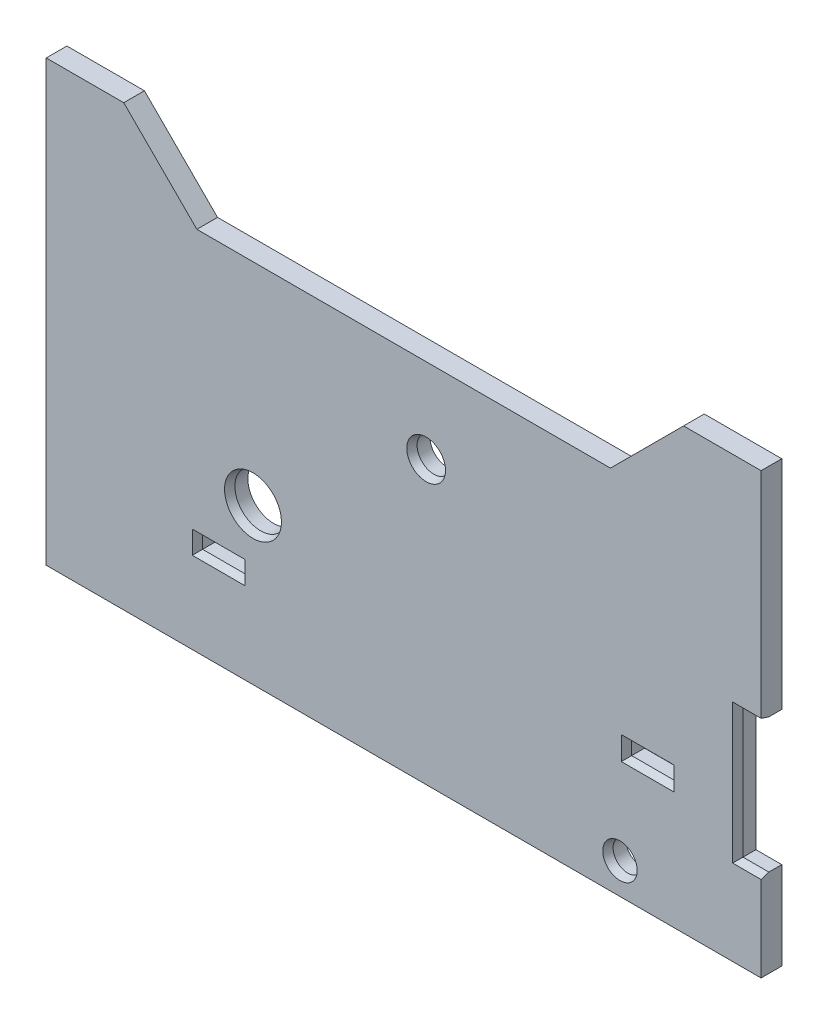
ISO-10303-21;
HEADER;
FILE_DESCRIPTION(('STEP AP214'),'2;1');
FILE_NAME('part.step','',(''),(''),'','','');
FILE_SCHEMA(('AUTOMOTIVE_DESIGN { 1 0 10303 214 1 1 1 1 }'));
ENDSEC;
DATA;
#1=APPLICATION_CONTEXT('core data for automotive mechanical design processes');
#2=APPLICATION_PROTOCOL_DEFINITION('international standard','automotive_design',2000,#1);
#3=PRODUCT_CONTEXT('',#1,'mechanical');
#4=PRODUCT('Part','Part','',(#3));
#5=PRODUCT_RELATED_PRODUCT_CATEGORY('part','',(#4));
#6=PRODUCT_DEFINITION_FORMATION('','',#4);
#7=PRODUCT_DEFINITION_CONTEXT('part definition',#1,'design');
#8=PRODUCT_DEFINITION('design','',#6,#7);
#9=PRODUCT_DEFINITION_SHAPE('','',#8);
#10=(LENGTH_UNIT() NAMED_UNIT(*) SI_UNIT(.MILLI.,.METRE.));
#11=(NAMED_UNIT(*) PLANE_ANGLE_UNIT() SI_UNIT($,.RADIAN.));
#12=(NAMED_UNIT(*) SI_UNIT($,.STERADIAN.) SOLID_ANGLE_UNIT());
#13=UNCERTAINTY_MEASURE_WITH_UNIT(LENGTH_MEASURE(1.E-05),#10,'distance_accuracy_value','');
#14=(GEOMETRIC_REPRESENTATION_CONTEXT(3) GLOBAL_UNCERTAINTY_ASSIGNED_CONTEXT((#13)) GLOBAL_UNIT_ASSIGNED_CONTEXT((#10,
#11,#12)) REPRESENTATION_CONTEXT('',''));
#15=CARTESIAN_POINT('',(0.,0.,0.));
#16=DIRECTION('',(0.,0.,1.));
#17=DIRECTION('',(1.,0.,0.));
#18=AXIS2_PLACEMENT_3D('',#15,#16,#17);
#19=CARTESIAN_POINT('',(0.,0.,2.));
#20=DIRECTION('',(0.,0.,-1.));
#21=DIRECTION('',(-1.,0.,0.));
#22=AXIS2_PLACEMENT_3D('',#19,#20,#21);
#23=PLANE('',#22);
#24=CARTESIAN_POINT('',(25.,-24.,2.));
#25=DIRECTION('',(0.,0.,-1.));
#26=DIRECTION('',(-1.,0.,0.));
#27=AXIS2_PLACEMENT_3D('',#24,#25,#26);
#28=CIRCLE('',#27,3.33000000000003);
#29=CARTESIAN_POINT('',(21.67,-24.,2.));
#30=VERTEX_POINT('',#29);
#31=EDGE_CURVE('E379',#30,#30,#28,.T.);
#32=ORIENTED_EDGE('',*,*,#31,.T.);
#33=EDGE_LOOP('',(#32));
#34=FACE_BOUND('',#33,.T.);
#35=DIRECTION('',(0.,-1.,0.));
#36=VECTOR('',#35,1.);
#37=CARTESIAN_POINT('',(35.45,-6.765,2.));
#38=LINE('',#37,#36);
#39=CARTESIAN_POINT('',(35.45,-2.735,2.));
#40=VERTEX_POINT('',#39);
#41=CARTESIAN_POINT('',(35.45,-7.265,2.));
#42=VERTEX_POINT('',#41);
#43=EDGE_CURVE('E370',#40,#42,#38,.T.);
#44=ORIENTED_EDGE('',*,*,#43,.T.);
#45=DIRECTION('',(-1.,0.,0.));
#46=VECTOR('',#45,1.);
#47=CARTESIAN_POINT('',(25.75,-7.265,2.));
#48=LINE('',#47,#46);
#49=CARTESIAN_POINT('',(25.25,-7.265,2.));
#50=VERTEX_POINT('',#49);
#51=EDGE_CURVE('E376',#42,#50,#48,.T.);
#52=ORIENTED_EDGE('',*,*,#51,.T.);
#53=DIRECTION('',(0.,1.,0.));
#54=VECTOR('',#53,1.);
#55=CARTESIAN_POINT('',(25.25,-3.235,2.));
#56=LINE('',#55,#54);
#57=CARTESIAN_POINT('',(25.25,-2.735,2.));
#58=VERTEX_POINT('',#57);
#59=EDGE_CURVE('E374',#50,#58,#56,.T.);
#60=ORIENTED_EDGE('',*,*,#59,.T.);
#61=DIRECTION('',(1.,0.,0.));
#62=VECTOR('',#61,1.);
#63=CARTESIAN_POINT('',(34.95,-2.735,2.));
#64=LINE('',#63,#62);
#65=EDGE_CURVE('E372',#58,#40,#64,.T.);
#66=ORIENTED_EDGE('',*,*,#65,.T.);
#67=EDGE_LOOP('',(#44,#52,#60,#66));
#68=FACE_BOUND('',#67,.T.);
#69=DIRECTION('',(1.,0.,0.));
#70=VECTOR('',#69,1.);
#71=CARTESIAN_POINT('',(-48.05,-9.80000000000001,2.));
#72=LINE('',#71,#70);
#73=CARTESIAN_POINT('',(-57.75,-9.80000000000001,2.));
#74=VERTEX_POINT('',#73);
#75=CARTESIAN_POINT('',(-47.55,-9.80000000000001,2.));
#76=VERTEX_POINT('',#75);
#77=EDGE_CURVE('E361',#74,#76,#72,.T.);
#78=ORIENTED_EDGE('',*,*,#77,.T.);
#79=DIRECTION('',(0.,-1.,0.));
#80=VECTOR('',#79,1.);
#81=CARTESIAN_POINT('',(-47.55,-13.7,2.));
#82=LINE('',#81,#80);
#83=CARTESIAN_POINT('',(-47.55,-14.2,2.));
#84=VERTEX_POINT('',#83);
#85=EDGE_CURVE('E367',#76,#84,#82,.T.);
#86=ORIENTED_EDGE('',*,*,#85,.T.);
#87=DIRECTION('',(-1.,0.,0.));
#88=VECTOR('',#87,1.);
#89=CARTESIAN_POINT('',(-57.25,-14.2,2.));
#90=LINE('',#89,#88);
#91=CARTESIAN_POINT('',(-57.75,-14.2,2.));
#92=VERTEX_POINT('',#91);
#93=EDGE_CURVE('E365',#84,#92,#90,.T.);
#94=ORIENTED_EDGE('',*,*,#93,.T.);
#95=DIRECTION('',(0.,1.,0.));
#96=VECTOR('',#95,1.);
#97=CARTESIAN_POINT('',(-57.75,-10.3,2.));
#98=LINE('',#97,#96);
#99=EDGE_CURVE('E363',#92,#74,#98,.T.);
#100=ORIENTED_EDGE('',*,*,#99,.T.);
#101=EDGE_LOOP('',(#78,#86,#94,#100));
#102=FACE_BOUND('',#101,.T.);
#103=CARTESIAN_POINT('',(-46.,0.,2.));
#104=DIRECTION('',(0.,0.,-1.));
#105=DIRECTION('',(-1.,0.,0.));
#106=AXIS2_PLACEMENT_3D('',#103,#104,#105);
#107=CIRCLE('',#106,5.49999999999997);
#108=CARTESIAN_POINT('',(-51.5,0.,2.));
#109=VERTEX_POINT('',#108);
#110=EDGE_CURVE('E358',#109,#109,#107,.T.);
#111=ORIENTED_EDGE('',*,*,#110,.T.);
#112=EDGE_LOOP('',(#111));
#113=FACE_BOUND('',#112,.T.);
#114=CARTESIAN_POINT('',(-12.5,24.5,2.));
#115=DIRECTION('',(0.,0.,-1.));
#116=DIRECTION('',(-1.,0.,0.));
#117=AXIS2_PLACEMENT_3D('',#114,#115,#116);
#118=CIRCLE('',#117,3.75000000000003);
#119=CARTESIAN_POINT('',(-16.25,24.5,2.));
#120=VERTEX_POINT('',#119);
#121=EDGE_CURVE('E355',#120,#120,#118,.T.);
#122=ORIENTED_EDGE('',*,*,#121,.T.);
#123=EDGE_LOOP('',(#122));
#124=FACE_BOUND('',#123,.T.);
#125=DIRECTION('',(0.,1.,0.));
#126=VECTOR('',#125,1.);
#127=CARTESIAN_POINT('',(52.3,-13.,2.));
#128=LINE('',#127,#126);
#129=CARTESIAN_POINT('',(52.3,-30.,2.));
#130=VERTEX_POINT('',#129);
#131=CARTESIAN_POINT('',(52.3,-13.5,2.));
#132=VERTEX_POINT('',#131);
#133=EDGE_CURVE('E216',#130,#132,#128,.T.);
#134=ORIENTED_EDGE('',*,*,#133,.T.);
#135=DIRECTION('',(-1.,0.,0.));
#136=VECTOR('',#135,1.);
#137=CARTESIAN_POINT('',(0.,-13.5,2.));
#138=LINE('',#137,#136);
#139=CARTESIAN_POINT('',(46.8000000000001,-13.5,2.));
#140=VERTEX_POINT('',#139);
#141=EDGE_CURVE('E428',#132,#140,#138,.T.);
#142=ORIENTED_EDGE('',*,*,#141,.T.);
#143=DIRECTION('',(0.,1.,0.));
#144=VECTOR('',#143,1.);
#145=CARTESIAN_POINT('',(46.8,1.49880108324396E-13,2.));
#146=LINE('',#145,#144);
#147=CARTESIAN_POINT('',(46.8,13.5,2.));
#148=VERTEX_POINT('',#147);
#149=EDGE_CURVE('E426',#140,#148,#146,.T.);
#150=ORIENTED_EDGE('',*,*,#149,.T.);
#151=DIRECTION('',(1.,0.,0.));
#152=VECTOR('',#151,1.);
#153=CARTESIAN_POINT('',(0.,13.5,2.));
#154=LINE('',#153,#152);
#155=CARTESIAN_POINT('',(52.3,13.5,2.));
#156=VERTEX_POINT('',#155);
#157=EDGE_CURVE('E214',#148,#156,#154,.T.);
#158=ORIENTED_EDGE('',*,*,#157,.T.);
#159=DIRECTION('',(0.,1.,0.));
#160=VECTOR('',#159,1.);
#161=CARTESIAN_POINT('',(52.3,30.,2.));
#162=LINE('',#161,#160);
#163=CARTESIAN_POINT('',(52.3,55.,2.));
#164=VERTEX_POINT('',#163);
#165=EDGE_CURVE('E207',#156,#164,#162,.T.);
#166=ORIENTED_EDGE('',*,*,#165,.T.);
#167=DIRECTION('',(-1.,0.,0.));
#168=VECTOR('',#167,1.);
#169=CARTESIAN_POINT('',(52.3,55.,2.));
#170=LINE('',#169,#168);
#171=CARTESIAN_POINT('',(37.3,55.,2.));
#172=VERTEX_POINT('',#171);
#173=EDGE_CURVE('E211',#164,#172,#170,.T.);
#174=ORIENTED_EDGE('',*,*,#173,.T.);
#175=DIRECTION('',(-0.707106781186548,-0.707106781186546,0.));
#176=VECTOR('',#175,1.);
#177=CARTESIAN_POINT('',(37.3,55.,2.));
#178=LINE('',#177,#176);
#179=CARTESIAN_POINT('',(23.157864376269,40.857864376269,2.));
#180=VERTEX_POINT('',#179);
#181=EDGE_CURVE('E231',#172,#180,#178,.T.);
#182=ORIENTED_EDGE('',*,*,#181,.T.);
#183=DIRECTION('',(-1.,0.,0.));
#184=VECTOR('',#183,1.);
#185=CARTESIAN_POINT('',(23.157864376269,40.857864376269,2.));
#186=LINE('',#185,#184);
#187=CARTESIAN_POINT('',(-56.8578643762691,40.857864376269,2.));
#188=VERTEX_POINT('',#187);
#189=EDGE_CURVE('E234',#180,#188,#186,.T.);
#190=ORIENTED_EDGE('',*,*,#189,.T.);
#191=DIRECTION('',(-0.707106781186547,0.707106781186548,0.));
#192=VECTOR('',#191,1.);
#193=CARTESIAN_POINT('',(-56.8578643762691,40.857864376269,2.));
#194=LINE('',#193,#192);
#195=CARTESIAN_POINT('',(-71.,55.,2.));
#196=VERTEX_POINT('',#195);
#197=EDGE_CURVE('E241',#188,#196,#194,.T.);
#198=ORIENTED_EDGE('',*,*,#197,.T.);
#199=DIRECTION('',(-1.,0.,0.));
#200=VECTOR('',#199,1.);
#201=CARTESIAN_POINT('',(-71.,55.,2.));
#202=LINE('',#201,#200);
#203=CARTESIAN_POINT('',(-86.,55.,2.));
#204=VERTEX_POINT('',#203);
#205=EDGE_CURVE('E243',#196,#204,#202,.T.);
#206=ORIENTED_EDGE('',*,*,#205,.T.);
#207=DIRECTION('',(0.,-1.,0.));
#208=VECTOR('',#207,1.);
#209=CARTESIAN_POINT('',(-86.,-30.,2.));
#210=LINE('',#209,#208);
#211=CARTESIAN_POINT('',(-86.,-30.,2.));
#212=VERTEX_POINT('',#211);
#213=EDGE_CURVE('E215',#204,#212,#210,.T.);
#214=ORIENTED_EDGE('',*,*,#213,.T.);
#215=DIRECTION('',(1.,0.,0.));
#216=VECTOR('',#215,1.);
#217=CARTESIAN_POINT('',(-86.,-30.,2.));
#218=LINE('',#217,#216);
#219=EDGE_CURVE('E316',#212,#130,#218,.T.);
#220=ORIENTED_EDGE('',*,*,#219,.T.);
#221=EDGE_LOOP('',(#134,#142,#150,#158,#166,#174,#182,#190,#198,#206,#214,#220));
#222=FACE_BOUND('',#221,.T.);
#223=ADVANCED_FACE('F35',(#34,#68,#102,#113,#124,#222),#23,.F.);
#224=CARTESIAN_POINT('',(0.,0.,-2.));
#225=DIRECTION('',(0.,0.,-1.));
#226=DIRECTION('',(-1.,0.,0.));
#227=AXIS2_PLACEMENT_3D('',#224,#225,#226);
#228=PLANE('',#227);
#229=DIRECTION('',(-1.,0.,0.));
#230=VECTOR('',#229,1.);
#231=CARTESIAN_POINT('',(25.75,-3.235,-2.));
#232=LINE('',#231,#230);
#233=CARTESIAN_POINT('',(34.95,-3.235,-2.));
#234=VERTEX_POINT('',#233);
#235=CARTESIAN_POINT('',(25.75,-3.235,-2.));
#236=VERTEX_POINT('',#235);
#237=EDGE_CURVE('E278',#234,#236,#232,.T.);
#238=ORIENTED_EDGE('',*,*,#237,.T.);
#239=DIRECTION('',(0.,-1.,0.));
#240=VECTOR('',#239,1.);
#241=CARTESIAN_POINT('',(25.75,-3.235,-2.));
#242=LINE('',#241,#240);
#243=CARTESIAN_POINT('',(25.75,-6.765,-2.));
#244=VERTEX_POINT('',#243);
#245=EDGE_CURVE('E269',#236,#244,#242,.T.);
#246=ORIENTED_EDGE('',*,*,#245,.T.);
#247=DIRECTION('',(1.,0.,0.));
#248=VECTOR('',#247,1.);
#249=CARTESIAN_POINT('',(25.75,-6.765,-2.));
#250=LINE('',#249,#248);
#251=CARTESIAN_POINT('',(34.95,-6.765,-2.));
#252=VERTEX_POINT('',#251);
#253=EDGE_CURVE('E272',#244,#252,#250,.T.);
#254=ORIENTED_EDGE('',*,*,#253,.T.);
#255=DIRECTION('',(0.,1.,0.));
#256=VECTOR('',#255,1.);
#257=CARTESIAN_POINT('',(34.95,-3.235,-2.));
#258=LINE('',#257,#256);
#259=EDGE_CURVE('E275',#252,#234,#258,.T.);
#260=ORIENTED_EDGE('',*,*,#259,.T.);
#261=EDGE_LOOP('',(#238,#246,#254,#260));
#262=FACE_BOUND('',#261,.T.);
#263=CARTESIAN_POINT('',(-46.,0.,-2.));
#264=DIRECTION('',(0.,0.,1.));
#265=DIRECTION('',(1.,0.,0.));
#266=AXIS2_PLACEMENT_3D('',#263,#264,#265);
#267=CIRCLE('',#266,5.);
#268=CARTESIAN_POINT('',(-41.,0.,-2.));
#269=VERTEX_POINT('',#268);
#270=EDGE_CURVE('E289',#269,#269,#267,.T.);
#271=ORIENTED_EDGE('',*,*,#270,.T.);
#272=EDGE_LOOP('',(#271));
#273=FACE_BOUND('',#272,.T.);
#274=DIRECTION('',(-1.,0.,0.));
#275=VECTOR('',#274,1.);
#276=CARTESIAN_POINT('',(-57.25,-10.3,-2.));
#277=LINE('',#276,#275);
#278=CARTESIAN_POINT('',(-48.05,-10.3,-2.));
#279=VERTEX_POINT('',#278);
#280=CARTESIAN_POINT('',(-57.25,-10.3,-2.));
#281=VERTEX_POINT('',#280);
#282=EDGE_CURVE('E304',#279,#281,#277,.T.);
#283=ORIENTED_EDGE('',*,*,#282,.T.);
#284=DIRECTION('',(0.,-1.,0.));
#285=VECTOR('',#284,1.);
#286=CARTESIAN_POINT('',(-57.25,-10.3,-2.));
#287=LINE('',#286,#285);
#288=CARTESIAN_POINT('',(-57.25,-13.7,-2.));
#289=VERTEX_POINT('',#288);
#290=EDGE_CURVE('E295',#281,#289,#287,.T.);
#291=ORIENTED_EDGE('',*,*,#290,.T.);
#292=DIRECTION('',(1.,0.,0.));
#293=VECTOR('',#292,1.);
#294=CARTESIAN_POINT('',(-57.25,-13.7,-2.));
#295=LINE('',#294,#293);
#296=CARTESIAN_POINT('',(-48.05,-13.7,-2.));
#297=VERTEX_POINT('',#296);
#298=EDGE_CURVE('E298',#289,#297,#295,.T.);
#299=ORIENTED_EDGE('',*,*,#298,.T.);
#300=DIRECTION('',(0.,1.,0.));
#301=VECTOR('',#300,1.);
#302=CARTESIAN_POINT('',(-48.05,-10.3,-2.));
#303=LINE('',#302,#301);
#304=EDGE_CURVE('E301',#297,#279,#303,.T.);
#305=ORIENTED_EDGE('',*,*,#304,.T.);
#306=EDGE_LOOP('',(#283,#291,#299,#305));
#307=FACE_BOUND('',#306,.T.);
#308=DIRECTION('',(1.,0.,0.));
#309=VECTOR('',#308,1.);
#310=CARTESIAN_POINT('',(-86.,-30.,-2.));
#311=LINE('',#310,#309);
#312=CARTESIAN_POINT('',(-86.,-30.,-2.));
#313=VERTEX_POINT('',#312);
#314=CARTESIAN_POINT('',(52.3,-30.,-2.));
#315=VERTEX_POINT('',#314);
#316=EDGE_CURVE('E315',#313,#315,#311,.T.);
#317=ORIENTED_EDGE('',*,*,#316,.F.);
#318=DIRECTION('',(0.,-1.,0.));
#319=VECTOR('',#318,1.);
#320=CARTESIAN_POINT('',(-86.,-30.,-2.));
#321=LINE('',#320,#319);
#322=CARTESIAN_POINT('',(-86.,55.,-2.));
#323=VERTEX_POINT('',#322);
#324=EDGE_CURVE('E319',#323,#313,#321,.T.);
#325=ORIENTED_EDGE('',*,*,#324,.F.);
#326=DIRECTION('',(-1.,0.,0.));
#327=VECTOR('',#326,1.);
#328=CARTESIAN_POINT('',(-71.,55.,-2.));
#329=LINE('',#328,#327);
#330=CARTESIAN_POINT('',(-71.,55.,-2.));
#331=VERTEX_POINT('',#330);
#332=EDGE_CURVE('E232',#331,#323,#329,.T.);
#333=ORIENTED_EDGE('',*,*,#332,.F.);
#334=DIRECTION('',(-0.707106781186547,0.707106781186548,0.));
#335=VECTOR('',#334,1.);
#336=CARTESIAN_POINT('',(-56.8578643762691,40.857864376269,-2.));
#337=LINE('',#336,#335);
#338=CARTESIAN_POINT('',(-56.8578643762691,40.857864376269,-2.));
#339=VERTEX_POINT('',#338);
#340=EDGE_CURVE('E237',#339,#331,#337,.T.);
#341=ORIENTED_EDGE('',*,*,#340,.F.);
#342=DIRECTION('',(-1.,0.,0.));
#343=VECTOR('',#342,1.);
#344=CARTESIAN_POINT('',(23.157864376269,40.857864376269,-2.));
#345=LINE('',#344,#343);
#346=CARTESIAN_POINT('',(23.157864376269,40.857864376269,-2.));
#347=VERTEX_POINT('',#346);
#348=EDGE_CURVE('E252',#347,#339,#345,.T.);
#349=ORIENTED_EDGE('',*,*,#348,.F.);
#350=DIRECTION('',(-0.707106781186548,-0.707106781186546,0.));
#351=VECTOR('',#350,1.);
#352=CARTESIAN_POINT('',(37.3,55.,-2.));
#353=LINE('',#352,#351);
#354=CARTESIAN_POINT('',(37.3,55.,-2.));
#355=VERTEX_POINT('',#354);
#356=EDGE_CURVE('E249',#355,#347,#353,.T.);
#357=ORIENTED_EDGE('',*,*,#356,.F.);
#358=DIRECTION('',(-1.,0.,0.));
#359=VECTOR('',#358,1.);
#360=CARTESIAN_POINT('',(52.3,55.,-2.));
#361=LINE('',#360,#359);
#362=CARTESIAN_POINT('',(52.3,55.,-2.));
#363=VERTEX_POINT('',#362);
#364=EDGE_CURVE('E247',#363,#355,#361,.T.);
#365=ORIENTED_EDGE('',*,*,#364,.F.);
#366=DIRECTION('',(0.,1.,0.));
#367=VECTOR('',#366,1.);
#368=CARTESIAN_POINT('',(52.3,30.,-2.));
#369=LINE('',#368,#367);
#370=CARTESIAN_POINT('',(52.3,13.,-2.));
#371=VERTEX_POINT('',#370);
#372=EDGE_CURVE('E222',#371,#363,#369,.T.);
#373=ORIENTED_EDGE('',*,*,#372,.F.);
#374=DIRECTION('',(1.,0.,0.));
#375=VECTOR('',#374,1.);
#376=CARTESIAN_POINT('',(52.3,13.,-2.));
#377=LINE('',#376,#375);
#378=CARTESIAN_POINT('',(47.3,13.,-2.));
#379=VERTEX_POINT('',#378);
#380=EDGE_CURVE('E334',#379,#371,#377,.T.);
#381=ORIENTED_EDGE('',*,*,#380,.F.);
#382=DIRECTION('',(0.,1.,0.));
#383=VECTOR('',#382,1.);
#384=CARTESIAN_POINT('',(47.3,13.,-2.));
#385=LINE('',#384,#383);
#386=CARTESIAN_POINT('',(47.3000000000001,-13.,-2.));
#387=VERTEX_POINT('',#386);
#388=EDGE_CURVE('E331',#387,#379,#385,.T.);
#389=ORIENTED_EDGE('',*,*,#388,.F.);
#390=DIRECTION('',(-1.,0.,0.));
#391=VECTOR('',#390,1.);
#392=CARTESIAN_POINT('',(47.3000000000001,-13.,-2.));
#393=LINE('',#392,#391);
#394=CARTESIAN_POINT('',(52.3,-13.,-2.));
#395=VERTEX_POINT('',#394);
#396=EDGE_CURVE('E328',#395,#387,#393,.T.);
#397=ORIENTED_EDGE('',*,*,#396,.F.);
#398=DIRECTION('',(0.,1.,0.));
#399=VECTOR('',#398,1.);
#400=CARTESIAN_POINT('',(52.3,-13.,-2.));
#401=LINE('',#400,#399);
#402=EDGE_CURVE('E325',#315,#395,#401,.T.);
#403=ORIENTED_EDGE('',*,*,#402,.F.);
#404=EDGE_LOOP('',(#317,#325,#333,#341,#349,#357,#365,#373,#381,#389,#397,#403));
#405=FACE_BOUND('',#404,.T.);
#406=CARTESIAN_POINT('',(-12.5,24.5,-2.));
#407=DIRECTION('',(0.,0.,1.));
#408=DIRECTION('',(1.,0.,0.));
#409=AXIS2_PLACEMENT_3D('',#406,#407,#408);
#410=CIRCLE('',#409,3.25);
#411=CARTESIAN_POINT('',(-9.25,24.5,-2.));
#412=VERTEX_POINT('',#411);
#413=EDGE_CURVE('E292',#412,#412,#410,.T.);
#414=ORIENTED_EDGE('',*,*,#413,.T.);
#415=EDGE_LOOP('',(#414));
#416=FACE_BOUND('',#415,.T.);
#417=CARTESIAN_POINT('',(25.,-24.,-2.));
#418=DIRECTION('',(0.,0.,1.));
#419=DIRECTION('',(1.,0.,0.));
#420=AXIS2_PLACEMENT_3D('',#417,#418,#419);
#421=CIRCLE('',#420,2.83);
#422=CARTESIAN_POINT('',(27.83,-24.,-2.));
#423=VERTEX_POINT('',#422);
#424=EDGE_CURVE('E225',#423,#423,#421,.T.);
#425=ORIENTED_EDGE('',*,*,#424,.T.);
#426=EDGE_LOOP('',(#425));
#427=FACE_BOUND('',#426,.T.);
#428=ADVANCED_FACE('F460',(#262,#273,#307,#405,#416,#427),#228,.T.);
#429=CARTESIAN_POINT('',(-86.,-30.,2.));
#430=DIRECTION('',(0.,1.,0.));
#431=DIRECTION('',(0.,0.,1.));
#432=AXIS2_PLACEMENT_3D('',#429,#430,#431);
#433=PLANE('',#432);
#434=ORIENTED_EDGE('',*,*,#316,.T.);
#435=DIRECTION('',(0.,0.,-1.));
#436=VECTOR('',#435,1.);
#437=CARTESIAN_POINT('',(52.3,-30.,2.));
#438=LINE('',#437,#436);
#439=EDGE_CURVE('E349',#130,#315,#438,.T.);
#440=ORIENTED_EDGE('',*,*,#439,.F.);
#441=ORIENTED_EDGE('',*,*,#219,.F.);
#442=DIRECTION('',(0.,0.,-1.));
#443=VECTOR('',#442,1.);
#444=CARTESIAN_POINT('',(-86.,-30.,2.));
#445=LINE('',#444,#443);
#446=EDGE_CURVE('E322',#212,#313,#445,.T.);
#447=ORIENTED_EDGE('',*,*,#446,.T.);
#448=EDGE_LOOP('',(#434,#440,#441,#447));
#449=FACE_BOUND('',#448,.T.);
#450=ADVANCED_FACE('F466',(#449),#433,.F.);
#451=CARTESIAN_POINT('',(52.3,-13.,2.));
#452=DIRECTION('',(-1.,0.,0.));
#453=DIRECTION('',(0.,-1.,0.));
#454=AXIS2_PLACEMENT_3D('',#451,#452,#453);
#455=PLANE('',#454);
#456=DIRECTION('',(0.,0.,-1.));
#457=VECTOR('',#456,1.);
#458=CARTESIAN_POINT('',(52.3,-13.,2.));
#459=LINE('',#458,#457);
#460=CARTESIAN_POINT('',(52.3,-13.,0.499999999999999));
#461=VERTEX_POINT('',#460);
#462=EDGE_CURVE('E347',#461,#395,#459,.T.);
#463=ORIENTED_EDGE('',*,*,#462,.F.);
#464=DIRECTION('',(0.,0.316227766016838,-0.948683298050514));
#465=VECTOR('',#464,1.);
#466=CARTESIAN_POINT('',(52.3,-13.5,2.00000000000001));
#467=LINE('',#466,#465);
#468=EDGE_CURVE('E433',#461,#132,#467,.F.);
#469=ORIENTED_EDGE('',*,*,#468,.T.);
#470=ORIENTED_EDGE('',*,*,#133,.F.);
#471=ORIENTED_EDGE('',*,*,#439,.T.);
#472=ORIENTED_EDGE('',*,*,#402,.T.);
#473=EDGE_LOOP('',(#463,#469,#470,#471,#472));
#474=FACE_BOUND('',#473,.T.);
#475=ADVANCED_FACE('F490',(#474),#455,.F.);
#476=CARTESIAN_POINT('',(47.3000000000001,-13.,2.));
#477=DIRECTION('',(0.,-1.,0.));
#478=DIRECTION('',(1.,0.,0.));
#479=AXIS2_PLACEMENT_3D('',#476,#477,#478);
#480=PLANE('',#479);
#481=DIRECTION('',(0.,0.,-1.));
#482=VECTOR('',#481,1.);
#483=CARTESIAN_POINT('',(47.3000000000001,-13.,2.));
#484=LINE('',#483,#482);
#485=CARTESIAN_POINT('',(47.3000000000001,-13.,0.499999999999999));
#486=VERTEX_POINT('',#485);
#487=EDGE_CURVE('E345',#486,#387,#484,.T.);
#488=ORIENTED_EDGE('',*,*,#487,.F.);
#489=DIRECTION('',(1.,0.,0.));
#490=VECTOR('',#489,1.);
#491=CARTESIAN_POINT('',(47.3000000000001,-13.,0.499999999999999));
#492=LINE('',#491,#490);
#493=EDGE_CURVE('E431',#486,#461,#492,.T.);
#494=ORIENTED_EDGE('',*,*,#493,.T.);
#495=ORIENTED_EDGE('',*,*,#462,.T.);
#496=ORIENTED_EDGE('',*,*,#396,.T.);
#497=EDGE_LOOP('',(#488,#494,#495,#496));
#498=FACE_BOUND('',#497,.T.);
#499=ADVANCED_FACE('F486',(#498),#480,.F.);
#500=CARTESIAN_POINT('',(47.3,13.,2.));
#501=DIRECTION('',(-1.,0.,0.));
#502=DIRECTION('',(0.,-1.,0.));
#503=AXIS2_PLACEMENT_3D('',#500,#501,#502);
#504=PLANE('',#503);
#505=DIRECTION('',(0.,0.,-1.));
#506=VECTOR('',#505,1.);
#507=CARTESIAN_POINT('',(47.3,13.,2.));
#508=LINE('',#507,#506);
#509=CARTESIAN_POINT('',(47.3,13.,0.499999999999999));
#510=VERTEX_POINT('',#509);
#511=EDGE_CURVE('E343',#510,#379,#508,.T.);
#512=ORIENTED_EDGE('',*,*,#511,.F.);
#513=DIRECTION('',(0.,-1.,0.));
#514=VECTOR('',#513,1.);
#515=CARTESIAN_POINT('',(47.3,13.,0.499999999999999));
#516=LINE('',#515,#514);
#517=EDGE_CURVE('E435',#510,#486,#516,.T.);
#518=ORIENTED_EDGE('',*,*,#517,.T.);
#519=ORIENTED_EDGE('',*,*,#487,.T.);
#520=ORIENTED_EDGE('',*,*,#388,.T.);
#521=EDGE_LOOP('',(#512,#518,#519,#520));
#522=FACE_BOUND('',#521,.T.);
#523=ADVANCED_FACE('F483',(#522),#504,.F.);
#524=CARTESIAN_POINT('',(52.3,13.,2.));
#525=DIRECTION('',(0.,1.,0.));
#526=DIRECTION('',(-1.,0.,0.));
#527=AXIS2_PLACEMENT_3D('',#524,#525,#526);
#528=PLANE('',#527);
#529=DIRECTION('',(0.,0.,-1.));
#530=VECTOR('',#529,1.);
#531=CARTESIAN_POINT('',(52.3,13.,2.));
#532=LINE('',#531,#530);
#533=CARTESIAN_POINT('',(52.3,13.,0.499999999999999));
#534=VERTEX_POINT('',#533);
#535=EDGE_CURVE('E341',#534,#371,#532,.T.);
#536=ORIENTED_EDGE('',*,*,#535,.F.);
#537=DIRECTION('',(-1.,0.,0.));
#538=VECTOR('',#537,1.);
#539=CARTESIAN_POINT('',(52.3,13.,0.499999999999999));
#540=LINE('',#539,#538);
#541=EDGE_CURVE('E11',#534,#510,#540,.T.);
#542=ORIENTED_EDGE('',*,*,#541,.T.);
#543=ORIENTED_EDGE('',*,*,#511,.T.);
#544=ORIENTED_EDGE('',*,*,#380,.T.);
#545=EDGE_LOOP('',(#536,#542,#543,#544));
#546=FACE_BOUND('',#545,.T.);
#547=ADVANCED_FACE('F480',(#546),#528,.F.);
#548=CARTESIAN_POINT('',(52.3,30.,2.));
#549=DIRECTION('',(-1.,0.,0.));
#550=DIRECTION('',(0.,-1.,0.));
#551=AXIS2_PLACEMENT_3D('',#548,#549,#550);
#552=PLANE('',#551);
#553=ORIENTED_EDGE('',*,*,#165,.F.);
#554=DIRECTION('',(0.,0.316227766016839,0.948683298050513));
#555=VECTOR('',#554,1.);
#556=CARTESIAN_POINT('',(52.3,13.5,1.99999999999999));
#557=LINE('',#556,#555);
#558=EDGE_CURVE('E45',#156,#534,#557,.F.);
#559=ORIENTED_EDGE('',*,*,#558,.T.);
#560=ORIENTED_EDGE('',*,*,#535,.T.);
#561=ORIENTED_EDGE('',*,*,#372,.T.);
#562=DIRECTION('',(0.,0.,-1.));
#563=VECTOR('',#562,1.);
#564=CARTESIAN_POINT('',(52.3,55.,2.));
#565=LINE('',#564,#563);
#566=EDGE_CURVE('E219',#164,#363,#565,.T.);
#567=ORIENTED_EDGE('',*,*,#566,.F.);
#568=EDGE_LOOP('',(#553,#559,#560,#561,#567));
#569=FACE_BOUND('',#568,.T.);
#570=ADVANCED_FACE('F220',(#569),#552,.F.);
#571=CARTESIAN_POINT('',(-86.,-30.,2.));
#572=DIRECTION('',(1.,0.,0.));
#573=DIRECTION('',(0.,1.,0.));
#574=AXIS2_PLACEMENT_3D('',#571,#572,#573);
#575=PLANE('',#574);
#576=ORIENTED_EDGE('',*,*,#324,.T.);
#577=ORIENTED_EDGE('',*,*,#446,.F.);
#578=ORIENTED_EDGE('',*,*,#213,.F.);
#579=DIRECTION('',(0.,0.,-1.));
#580=VECTOR('',#579,1.);
#581=CARTESIAN_POINT('',(-86.,55.,2.));
#582=LINE('',#581,#580);
#583=EDGE_CURVE('E246',#204,#323,#582,.T.);
#584=ORIENTED_EDGE('',*,*,#583,.T.);
#585=EDGE_LOOP('',(#576,#577,#578,#584));
#586=FACE_BOUND('',#585,.T.);
#587=ADVANCED_FACE('F474',(#586),#575,.F.);
#588=CARTESIAN_POINT('',(-57.25,-10.3,2.));
#589=DIRECTION('',(1.,0.,0.));
#590=DIRECTION('',(0.,1.,0.));
#591=AXIS2_PLACEMENT_3D('',#588,#589,#590);
#592=PLANE('',#591);
#593=DIRECTION('',(0.,0.,-1.));
#594=VECTOR('',#593,1.);
#595=CARTESIAN_POINT('',(-57.25,-10.3,2.));
#596=LINE('',#595,#594);
#597=CARTESIAN_POINT('',(-57.25,-10.3,0.499999999999971));
#598=VERTEX_POINT('',#597);
#599=EDGE_CURVE('E307',#598,#281,#596,.T.);
#600=ORIENTED_EDGE('',*,*,#599,.F.);
#601=DIRECTION('',(0.,-1.,0.));
#602=VECTOR('',#601,1.);
#603=CARTESIAN_POINT('',(-57.25,-13.7,0.499999999999971));
#604=LINE('',#603,#602);
#605=CARTESIAN_POINT('',(-57.25,-13.7,0.499999999999971));
#606=VERTEX_POINT('',#605);
#607=EDGE_CURVE('E396',#598,#606,#604,.T.);
#608=ORIENTED_EDGE('',*,*,#607,.T.);
#609=DIRECTION('',(0.,0.,-1.));
#610=VECTOR('',#609,1.);
#611=CARTESIAN_POINT('',(-57.25,-13.7,2.));
#612=LINE('',#611,#610);
#613=EDGE_CURVE('E313',#606,#289,#612,.T.);
#614=ORIENTED_EDGE('',*,*,#613,.T.);
#615=ORIENTED_EDGE('',*,*,#290,.F.);
#616=EDGE_LOOP('',(#600,#608,#614,#615));
#617=FACE_BOUND('',#616,.T.);
#618=ADVANCED_FACE('F471',(#617),#592,.T.);
#619=CARTESIAN_POINT('',(-57.25,-13.7,2.));
#620=DIRECTION('',(0.,1.,0.));
#621=DIRECTION('',(-1.,0.,0.));
#622=AXIS2_PLACEMENT_3D('',#619,#620,#621);
#623=PLANE('',#622);
#624=ORIENTED_EDGE('',*,*,#613,.F.);
#625=DIRECTION('',(1.,0.,0.));
#626=VECTOR('',#625,1.);
#627=CARTESIAN_POINT('',(-48.05,-13.7,0.499999999999971));
#628=LINE('',#627,#626);
#629=CARTESIAN_POINT('',(-48.05,-13.7,0.499999999999971));
#630=VERTEX_POINT('',#629);
#631=EDGE_CURVE('E394',#606,#630,#628,.T.);
#632=ORIENTED_EDGE('',*,*,#631,.T.);
#633=DIRECTION('',(0.,0.,-1.));
#634=VECTOR('',#633,1.);
#635=CARTESIAN_POINT('',(-48.05,-13.7,2.));
#636=LINE('',#635,#634);
#637=EDGE_CURVE('E311',#630,#297,#636,.T.);
#638=ORIENTED_EDGE('',*,*,#637,.T.);
#639=ORIENTED_EDGE('',*,*,#298,.F.);
#640=EDGE_LOOP('',(#624,#632,#638,#639));
#641=FACE_BOUND('',#640,.T.);
#642=ADVANCED_FACE('F659',(#641),#623,.T.);
#643=CARTESIAN_POINT('',(-48.05,-10.3,2.));
#644=DIRECTION('',(-1.,0.,0.));
#645=DIRECTION('',(0.,0.,1.));
#646=AXIS2_PLACEMENT_3D('',#643,#644,#645);
#647=PLANE('',#646);
#648=ORIENTED_EDGE('',*,*,#637,.F.);
#649=DIRECTION('',(0.,1.,0.));
#650=VECTOR('',#649,1.);
#651=CARTESIAN_POINT('',(-48.05,-10.3,0.499999999999971));
#652=LINE('',#651,#650);
#653=CARTESIAN_POINT('',(-48.05,-10.3,0.499999999999971));
#654=VERTEX_POINT('',#653);
#655=EDGE_CURVE('E391',#630,#654,#652,.T.);
#656=ORIENTED_EDGE('',*,*,#655,.T.);
#657=DIRECTION('',(0.,0.,-1.));
#658=VECTOR('',#657,1.);
#659=CARTESIAN_POINT('',(-48.05,-10.3,2.));
#660=LINE('',#659,#658);
#661=EDGE_CURVE('E309',#654,#279,#660,.T.);
#662=ORIENTED_EDGE('',*,*,#661,.T.);
#663=ORIENTED_EDGE('',*,*,#304,.F.);
#664=EDGE_LOOP('',(#648,#656,#662,#663));
#665=FACE_BOUND('',#664,.T.);
#666=ADVANCED_FACE('F656',(#665),#647,.T.);
#667=CARTESIAN_POINT('',(-57.25,-10.3,2.));
#668=DIRECTION('',(0.,-1.,0.));
#669=DIRECTION('',(1.,0.,0.));
#670=AXIS2_PLACEMENT_3D('',#667,#668,#669);
#671=PLANE('',#670);
#672=ORIENTED_EDGE('',*,*,#661,.F.);
#673=DIRECTION('',(-1.,0.,0.));
#674=VECTOR('',#673,1.);
#675=CARTESIAN_POINT('',(-57.25,-10.3,0.499999999999971));
#676=LINE('',#675,#674);
#677=EDGE_CURVE('E398',#654,#598,#676,.T.);
#678=ORIENTED_EDGE('',*,*,#677,.T.);
#679=ORIENTED_EDGE('',*,*,#599,.T.);
#680=ORIENTED_EDGE('',*,*,#282,.F.);
#681=EDGE_LOOP('',(#672,#678,#679,#680));
#682=FACE_BOUND('',#681,.T.);
#683=ADVANCED_FACE('F652',(#682),#671,.T.);
#684=CARTESIAN_POINT('',(-12.5,24.5,2.));
#685=DIRECTION('',(0.,0.,-1.));
#686=DIRECTION('',(-1.,0.,0.));
#687=AXIS2_PLACEMENT_3D('',#684,#685,#686);
#688=CYLINDRICAL_SURFACE('',#687,3.25);
#689=CARTESIAN_POINT('',(-12.5,24.5,0.499999999999891));
#690=DIRECTION('',(0.,0.,-1.));
#691=DIRECTION('',(-1.,0.,0.));
#692=AXIS2_PLACEMENT_3D('',#689,#690,#691);
#693=CIRCLE('',#692,3.25);
#694=CARTESIAN_POINT('',(-15.75,24.5,0.499999999999891));
#695=VERTEX_POINT('',#694);
#696=EDGE_CURVE('E403',#695,#695,#693,.F.);
#697=ORIENTED_EDGE('',*,*,#696,.T.);
#698=EDGE_LOOP('',(#697));
#699=FACE_BOUND('',#698,.T.);
#700=ORIENTED_EDGE('',*,*,#413,.F.);
#701=EDGE_LOOP('',(#700));
#702=FACE_BOUND('',#701,.T.);
#703=ADVANCED_FACE('F648',(#699,#702),#688,.F.);
#704=CARTESIAN_POINT('',(-46.,0.,2.));
#705=DIRECTION('',(0.,0.,-1.));
#706=DIRECTION('',(-1.,0.,0.));
#707=AXIS2_PLACEMENT_3D('',#704,#705,#706);
#708=CYLINDRICAL_SURFACE('',#707,5.);
#709=CARTESIAN_POINT('',(-46.,0.,0.500000000000073));
#710=DIRECTION('',(0.,0.,-1.));
#711=DIRECTION('',(-1.,0.,0.));
#712=AXIS2_PLACEMENT_3D('',#709,#710,#711);
#713=CIRCLE('',#712,5.);
#714=CARTESIAN_POINT('',(-51.,0.,0.500000000000073));
#715=VERTEX_POINT('',#714);
#716=EDGE_CURVE('E400',#715,#715,#713,.F.);
#717=ORIENTED_EDGE('',*,*,#716,.T.);
#718=EDGE_LOOP('',(#717));
#719=FACE_BOUND('',#718,.T.);
#720=ORIENTED_EDGE('',*,*,#270,.F.);
#721=EDGE_LOOP('',(#720));
#722=FACE_BOUND('',#721,.T.);
#723=ADVANCED_FACE('F644',(#719,#722),#708,.F.);
#724=CARTESIAN_POINT('',(25.75,-3.235,2.));
#725=DIRECTION('',(1.,0.,0.));
#726=DIRECTION('',(0.,1.,0.));
#727=AXIS2_PLACEMENT_3D('',#724,#725,#726);
#728=PLANE('',#727);
#729=DIRECTION('',(0.,0.,-1.));
#730=VECTOR('',#729,1.);
#731=CARTESIAN_POINT('',(25.75,-3.235,2.));
#732=LINE('',#731,#730);
#733=CARTESIAN_POINT('',(25.75,-3.235,0.499999999999999));
#734=VERTEX_POINT('',#733);
#735=EDGE_CURVE('E281',#734,#236,#732,.T.);
#736=ORIENTED_EDGE('',*,*,#735,.F.);
#737=DIRECTION('',(0.,-1.,0.));
#738=VECTOR('',#737,1.);
#739=CARTESIAN_POINT('',(25.75,-6.765,0.499999999999999));
#740=LINE('',#739,#738);
#741=CARTESIAN_POINT('',(25.75,-6.765,0.499999999999999));
#742=VERTEX_POINT('',#741);
#743=EDGE_CURVE('E385',#734,#742,#740,.T.);
#744=ORIENTED_EDGE('',*,*,#743,.T.);
#745=DIRECTION('',(0.,0.,-1.));
#746=VECTOR('',#745,1.);
#747=CARTESIAN_POINT('',(25.75,-6.765,2.));
#748=LINE('',#747,#746);
#749=EDGE_CURVE('E287',#742,#244,#748,.T.);
#750=ORIENTED_EDGE('',*,*,#749,.T.);
#751=ORIENTED_EDGE('',*,*,#245,.F.);
#752=EDGE_LOOP('',(#736,#744,#750,#751));
#753=FACE_BOUND('',#752,.T.);
#754=ADVANCED_FACE('F640',(#753),#728,.T.);
#755=CARTESIAN_POINT('',(25.75,-6.765,2.));
#756=DIRECTION('',(0.,1.,0.));
#757=DIRECTION('',(0.,0.,1.));
#758=AXIS2_PLACEMENT_3D('',#755,#756,#757);
#759=PLANE('',#758);
#760=ORIENTED_EDGE('',*,*,#749,.F.);
#761=DIRECTION('',(1.,0.,0.));
#762=VECTOR('',#761,1.);
#763=CARTESIAN_POINT('',(34.95,-6.765,0.499999999999999));
#764=LINE('',#763,#762);
#765=CARTESIAN_POINT('',(34.95,-6.765,0.499999999999999));
#766=VERTEX_POINT('',#765);
#767=EDGE_CURVE('E382',#742,#766,#764,.T.);
#768=ORIENTED_EDGE('',*,*,#767,.T.);
#769=DIRECTION('',(0.,0.,-1.));
#770=VECTOR('',#769,1.);
#771=CARTESIAN_POINT('',(34.95,-6.765,2.));
#772=LINE('',#771,#770);
#773=EDGE_CURVE('E285',#766,#252,#772,.T.);
#774=ORIENTED_EDGE('',*,*,#773,.T.);
#775=ORIENTED_EDGE('',*,*,#253,.F.);
#776=EDGE_LOOP('',(#760,#768,#774,#775));
#777=FACE_BOUND('',#776,.T.);
#778=ADVANCED_FACE('F636',(#777),#759,.T.);
#779=CARTESIAN_POINT('',(34.95,-3.235,2.));
#780=DIRECTION('',(-1.,0.,0.));
#781=DIRECTION('',(0.,-1.,0.));
#782=AXIS2_PLACEMENT_3D('',#779,#780,#781);
#783=PLANE('',#782);
#784=ORIENTED_EDGE('',*,*,#773,.F.);
#785=DIRECTION('',(0.,1.,0.));
#786=VECTOR('',#785,1.);
#787=CARTESIAN_POINT('',(34.95,-3.235,0.499999999999999));
#788=LINE('',#787,#786);
#789=CARTESIAN_POINT('',(34.95,-3.235,0.499999999999999));
#790=VERTEX_POINT('',#789);
#791=EDGE_CURVE('E389',#766,#790,#788,.T.);
#792=ORIENTED_EDGE('',*,*,#791,.T.);
#793=DIRECTION('',(0.,0.,-1.));
#794=VECTOR('',#793,1.);
#795=CARTESIAN_POINT('',(34.95,-3.235,2.));
#796=LINE('',#795,#794);
#797=EDGE_CURVE('E283',#790,#234,#796,.T.);
#798=ORIENTED_EDGE('',*,*,#797,.T.);
#799=ORIENTED_EDGE('',*,*,#259,.F.);
#800=EDGE_LOOP('',(#784,#792,#798,#799));
#801=FACE_BOUND('',#800,.T.);
#802=ADVANCED_FACE('F632',(#801),#783,.T.);
#803=CARTESIAN_POINT('',(25.75,-3.235,2.));
#804=DIRECTION('',(0.,-1.,0.));
#805=DIRECTION('',(1.,0.,0.));
#806=AXIS2_PLACEMENT_3D('',#803,#804,#805);
#807=PLANE('',#806);
#808=ORIENTED_EDGE('',*,*,#797,.F.);
#809=DIRECTION('',(-1.,0.,0.));
#810=VECTOR('',#809,1.);
#811=CARTESIAN_POINT('',(25.75,-3.235,0.499999999999999));
#812=LINE('',#811,#810);
#813=EDGE_CURVE('E387',#790,#734,#812,.T.);
#814=ORIENTED_EDGE('',*,*,#813,.T.);
#815=ORIENTED_EDGE('',*,*,#735,.T.);
#816=ORIENTED_EDGE('',*,*,#237,.F.);
#817=EDGE_LOOP('',(#808,#814,#815,#816));
#818=FACE_BOUND('',#817,.T.);
#819=ADVANCED_FACE('F628',(#818),#807,.T.);
#820=CARTESIAN_POINT('',(25.,-24.,2.));
#821=DIRECTION('',(0.,0.,-1.));
#822=DIRECTION('',(-1.,0.,0.));
#823=AXIS2_PLACEMENT_3D('',#820,#821,#822);
#824=CYLINDRICAL_SURFACE('',#823,2.83);
#825=CARTESIAN_POINT('',(25.,-24.,0.499999999999866));
#826=DIRECTION('',(0.,0.,-1.));
#827=DIRECTION('',(-1.,0.,0.));
#828=AXIS2_PLACEMENT_3D('',#825,#826,#827);
#829=CIRCLE('',#828,2.83);
#830=CARTESIAN_POINT('',(22.17,-24.,0.499999999999866));
#831=VERTEX_POINT('',#830);
#832=EDGE_CURVE('E352',#831,#831,#829,.F.);
#833=ORIENTED_EDGE('',*,*,#832,.T.);
#834=EDGE_LOOP('',(#833));
#835=FACE_BOUND('',#834,.T.);
#836=ORIENTED_EDGE('',*,*,#424,.F.);
#837=EDGE_LOOP('',(#836));
#838=FACE_BOUND('',#837,.T.);
#839=ADVANCED_FACE('F625',(#835,#838),#824,.F.);
#840=CARTESIAN_POINT('',(52.3,55.,2.));
#841=DIRECTION('',(0.,-1.,0.));
#842=DIRECTION('',(1.,0.,0.));
#843=AXIS2_PLACEMENT_3D('',#840,#841,#842);
#844=PLANE('',#843);
#845=ORIENTED_EDGE('',*,*,#364,.T.);
#846=DIRECTION('',(0.,0.,-1.));
#847=VECTOR('',#846,1.);
#848=CARTESIAN_POINT('',(37.3,55.,2.));
#849=LINE('',#848,#847);
#850=EDGE_CURVE('E226',#172,#355,#849,.T.);
#851=ORIENTED_EDGE('',*,*,#850,.F.);
#852=ORIENTED_EDGE('',*,*,#173,.F.);
#853=ORIENTED_EDGE('',*,*,#566,.T.);
#854=EDGE_LOOP('',(#845,#851,#852,#853));
#855=FACE_BOUND('',#854,.T.);
#856=ADVANCED_FACE('F228',(#855),#844,.F.);
#857=CARTESIAN_POINT('',(37.3,55.,2.));
#858=DIRECTION('',(0.707106781186547,-0.707106781186549,0.));
#859=DIRECTION('',(0.707106781186549,0.707106781186546,0.));
#860=AXIS2_PLACEMENT_3D('',#857,#858,#859);
#861=PLANE('',#860);
#862=ORIENTED_EDGE('',*,*,#356,.T.);
#863=DIRECTION('',(0.,0.,-1.));
#864=VECTOR('',#863,1.);
#865=CARTESIAN_POINT('',(23.157864376269,40.857864376269,2.));
#866=LINE('',#865,#864);
#867=EDGE_CURVE('E263',#180,#347,#866,.T.);
#868=ORIENTED_EDGE('',*,*,#867,.F.);
#869=ORIENTED_EDGE('',*,*,#181,.F.);
#870=ORIENTED_EDGE('',*,*,#850,.T.);
#871=EDGE_LOOP('',(#862,#868,#869,#870));
#872=FACE_BOUND('',#871,.T.);
#873=ADVANCED_FACE('F597',(#872),#861,.F.);
#874=CARTESIAN_POINT('',(23.157864376269,40.857864376269,2.));
#875=DIRECTION('',(0.,-1.,0.));
#876=DIRECTION('',(1.,0.,0.));
#877=AXIS2_PLACEMENT_3D('',#874,#875,#876);
#878=PLANE('',#877);
#879=ORIENTED_EDGE('',*,*,#348,.T.);
#880=DIRECTION('',(0.,0.,-1.));
#881=VECTOR('',#880,1.);
#882=CARTESIAN_POINT('',(-56.8578643762691,40.857864376269,2.));
#883=LINE('',#882,#881);
#884=EDGE_CURVE('E260',#188,#339,#883,.T.);
#885=ORIENTED_EDGE('',*,*,#884,.F.);
#886=ORIENTED_EDGE('',*,*,#189,.F.);
#887=ORIENTED_EDGE('',*,*,#867,.T.);
#888=EDGE_LOOP('',(#879,#885,#886,#887));
#889=FACE_BOUND('',#888,.T.);
#890=ADVANCED_FACE('F604',(#889),#878,.F.);
#891=CARTESIAN_POINT('',(-56.8578643762691,40.857864376269,2.));
#892=DIRECTION('',(-0.707106781186548,-0.707106781186547,0.));
#893=DIRECTION('',(0.707106781186547,-0.707106781186548,0.));
#894=AXIS2_PLACEMENT_3D('',#891,#892,#893);
#895=PLANE('',#894);
#896=ORIENTED_EDGE('',*,*,#340,.T.);
#897=DIRECTION('',(0.,0.,-1.));
#898=VECTOR('',#897,1.);
#899=CARTESIAN_POINT('',(-71.,55.,2.));
#900=LINE('',#899,#898);
#901=EDGE_CURVE('E257',#196,#331,#900,.T.);
#902=ORIENTED_EDGE('',*,*,#901,.F.);
#903=ORIENTED_EDGE('',*,*,#197,.F.);
#904=ORIENTED_EDGE('',*,*,#884,.T.);
#905=EDGE_LOOP('',(#896,#902,#903,#904));
#906=FACE_BOUND('',#905,.T.);
#907=ADVANCED_FACE('F607',(#906),#895,.F.);
#908=CARTESIAN_POINT('',(-71.,55.,2.));
#909=DIRECTION('',(0.,-1.,0.));
#910=DIRECTION('',(1.,0.,0.));
#911=AXIS2_PLACEMENT_3D('',#908,#909,#910);
#912=PLANE('',#911);
#913=ORIENTED_EDGE('',*,*,#332,.T.);
#914=ORIENTED_EDGE('',*,*,#583,.F.);
#915=ORIENTED_EDGE('',*,*,#205,.F.);
#916=ORIENTED_EDGE('',*,*,#901,.T.);
#917=EDGE_LOOP('',(#913,#914,#915,#916));
#918=FACE_BOUND('',#917,.T.);
#919=ADVANCED_FACE('F506',(#918),#912,.F.);
#920=CARTESIAN_POINT('',(25.,-24.,0.499999999999865));
#921=DIRECTION('',(0.,0.,1.));
#922=DIRECTION('',(1.,0.,0.));
#923=AXIS2_PLACEMENT_3D('',#920,#921,#922);
#924=CONICAL_SURFACE('',#923,2.83,0.321750554396639);
#925=ORIENTED_EDGE('',*,*,#31,.F.);
#926=EDGE_LOOP('',(#925));
#927=FACE_BOUND('',#926,.T.);
#928=ORIENTED_EDGE('',*,*,#832,.F.);
#929=EDGE_LOOP('',(#928));
#930=FACE_BOUND('',#929,.T.);
#931=ADVANCED_FACE('F499',(#927,#930),#924,.F.);
#932=CARTESIAN_POINT('',(25.75,-3.235,0.499999999999999));
#933=DIRECTION('',(0.,-0.948683298050514,0.316227766016838));
#934=DIRECTION('',(1.,0.,0.));
#935=AXIS2_PLACEMENT_3D('',#932,#933,#934);
#936=PLANE('',#935);
#937=DIRECTION('',(-0.301511344577763,-0.301511344577764,-0.904534033733291));
#938=VECTOR('',#937,1.);
#939=CARTESIAN_POINT('',(34.1136363636364,-4.07136363636363,-2.0090909090909));
#940=LINE('',#939,#938);
#941=EDGE_CURVE('E411',#40,#790,#940,.T.);
#942=ORIENTED_EDGE('',*,*,#941,.F.);
#943=ORIENTED_EDGE('',*,*,#65,.F.);
#944=DIRECTION('',(0.301511344577764,-0.301511344577764,-0.904534033733291));
#945=VECTOR('',#944,1.);
#946=CARTESIAN_POINT('',(25.75,-3.235,0.499999999999999));
#947=LINE('',#946,#945);
#948=EDGE_CURVE('E250',#734,#58,#947,.F.);
#949=ORIENTED_EDGE('',*,*,#948,.F.);
#950=ORIENTED_EDGE('',*,*,#813,.F.);
#951=EDGE_LOOP('',(#942,#943,#949,#950));
#952=FACE_BOUND('',#951,.T.);
#953=ADVANCED_FACE('F505',(#952),#936,.T.);
#954=CARTESIAN_POINT('',(25.75,-3.235,0.499999999999999));
#955=DIRECTION('',(0.948683298050514,0.,0.316227766016838));
#956=DIRECTION('',(0.,1.,0.));
#957=AXIS2_PLACEMENT_3D('',#954,#955,#956);
#958=PLANE('',#957);
#959=ORIENTED_EDGE('',*,*,#948,.T.);
#960=ORIENTED_EDGE('',*,*,#59,.F.);
#961=DIRECTION('',(0.301511344577764,0.301511344577764,-0.904534033733291));
#962=VECTOR('',#961,1.);
#963=CARTESIAN_POINT('',(25.75,-6.765,0.499999999999999));
#964=LINE('',#963,#962);
#965=EDGE_CURVE('E408',#742,#50,#964,.F.);
#966=ORIENTED_EDGE('',*,*,#965,.F.);
#967=ORIENTED_EDGE('',*,*,#743,.F.);
#968=EDGE_LOOP('',(#959,#960,#966,#967));
#969=FACE_BOUND('',#968,.T.);
#970=ADVANCED_FACE('F524',(#969),#958,.T.);
#971=CARTESIAN_POINT('',(34.95,-3.235,0.499999999999999));
#972=DIRECTION('',(-0.948683298050514,0.,0.316227766016838));
#973=DIRECTION('',(0.,-1.,0.));
#974=AXIS2_PLACEMENT_3D('',#971,#972,#973);
#975=PLANE('',#974);
#976=ORIENTED_EDGE('',*,*,#941,.T.);
#977=ORIENTED_EDGE('',*,*,#791,.F.);
#978=DIRECTION('',(0.301511344577764,-0.301511344577764,0.904534033733291));
#979=VECTOR('',#978,1.);
#980=CARTESIAN_POINT('',(34.1136363636364,-5.92863636363636,-2.00909090909091));
#981=LINE('',#980,#979);
#982=EDGE_CURVE('E406',#42,#766,#981,.F.);
#983=ORIENTED_EDGE('',*,*,#982,.F.);
#984=ORIENTED_EDGE('',*,*,#43,.F.);
#985=EDGE_LOOP('',(#976,#977,#983,#984));
#986=FACE_BOUND('',#985,.T.);
#987=ADVANCED_FACE('F517',(#986),#975,.T.);
#988=CARTESIAN_POINT('',(25.75,-6.765,0.499999999999999));
#989=DIRECTION('',(0.,0.948683298050514,0.316227766016838));
#990=DIRECTION('',(-1.,0.,0.));
#991=AXIS2_PLACEMENT_3D('',#988,#989,#990);
#992=PLANE('',#991);
#993=ORIENTED_EDGE('',*,*,#965,.T.);
#994=ORIENTED_EDGE('',*,*,#51,.F.);
#995=ORIENTED_EDGE('',*,*,#982,.T.);
#996=ORIENTED_EDGE('',*,*,#767,.F.);
#997=EDGE_LOOP('',(#993,#994,#995,#996));
#998=FACE_BOUND('',#997,.T.);
#999=ADVANCED_FACE('F509',(#998),#992,.T.);
#1000=CARTESIAN_POINT('',(-57.25,-10.3,0.499999999999971));
#1001=DIRECTION('',(0.948683298050513,0.,0.31622776601684));
#1002=DIRECTION('',(0.,1.,0.));
#1003=AXIS2_PLACEMENT_3D('',#1000,#1001,#1002);
#1004=PLANE('',#1003);
#1005=DIRECTION('',(0.301511344577766,-0.301511344577765,-0.904534033733289));
#1006=VECTOR('',#1005,1.);
#1007=CARTESIAN_POINT('',(-57.25,-10.3,0.499999999999971));
#1008=LINE('',#1007,#1006);
#1009=EDGE_CURVE('E420',#74,#598,#1008,.T.);
#1010=ORIENTED_EDGE('',*,*,#1009,.F.);
#1011=ORIENTED_EDGE('',*,*,#99,.F.);
#1012=DIRECTION('',(0.301511344577765,0.301511344577766,-0.904534033733289));
#1013=VECTOR('',#1012,1.);
#1014=CARTESIAN_POINT('',(-57.25,-13.7,0.499999999999971));
#1015=LINE('',#1014,#1013);
#1016=EDGE_CURVE('E409',#606,#92,#1015,.F.);
#1017=ORIENTED_EDGE('',*,*,#1016,.F.);
#1018=ORIENTED_EDGE('',*,*,#607,.F.);
#1019=EDGE_LOOP('',(#1010,#1011,#1017,#1018));
#1020=FACE_BOUND('',#1019,.T.);
#1021=ADVANCED_FACE('F516',(#1020),#1004,.T.);
#1022=CARTESIAN_POINT('',(-57.25,-13.7,0.499999999999971));
#1023=DIRECTION('',(0.,0.948683298050513,0.316227766016841));
#1024=DIRECTION('',(-1.,0.,0.));
#1025=AXIS2_PLACEMENT_3D('',#1022,#1023,#1024);
#1026=PLANE('',#1025);
#1027=ORIENTED_EDGE('',*,*,#1016,.T.);
#1028=ORIENTED_EDGE('',*,*,#93,.F.);
#1029=DIRECTION('',(-0.301511344577766,0.301511344577766,-0.904534033733289));
#1030=VECTOR('',#1029,1.);
#1031=CARTESIAN_POINT('',(-48.3590909090909,-13.3909090909091,-0.427272727272761));
#1032=LINE('',#1031,#1030);
#1033=EDGE_CURVE('E418',#630,#84,#1032,.F.);
#1034=ORIENTED_EDGE('',*,*,#1033,.F.);
#1035=ORIENTED_EDGE('',*,*,#631,.F.);
#1036=EDGE_LOOP('',(#1027,#1028,#1034,#1035));
#1037=FACE_BOUND('',#1036,.T.);
#1038=ADVANCED_FACE('F551',(#1037),#1026,.T.);
#1039=CARTESIAN_POINT('',(-57.25,-10.3,0.499999999999971));
#1040=DIRECTION('',(0.,-0.948683298050513,0.31622776601684));
#1041=DIRECTION('',(1.,0.,0.));
#1042=AXIS2_PLACEMENT_3D('',#1039,#1040,#1041);
#1043=PLANE('',#1042);
#1044=ORIENTED_EDGE('',*,*,#1009,.T.);
#1045=ORIENTED_EDGE('',*,*,#677,.F.);
#1046=DIRECTION('',(0.301511344577766,0.301511344577766,0.904534033733289));
#1047=VECTOR('',#1046,1.);
#1048=CARTESIAN_POINT('',(-48.05,-10.3,0.499999999999971));
#1049=LINE('',#1048,#1047);
#1050=EDGE_CURVE('E416',#76,#654,#1049,.F.);
#1051=ORIENTED_EDGE('',*,*,#1050,.F.);
#1052=ORIENTED_EDGE('',*,*,#77,.F.);
#1053=EDGE_LOOP('',(#1044,#1045,#1051,#1052));
#1054=FACE_BOUND('',#1053,.T.);
#1055=ADVANCED_FACE('F544',(#1054),#1043,.T.);
#1056=CARTESIAN_POINT('',(-48.05,-10.3,0.499999999999971));
#1057=DIRECTION('',(-0.948683298050513,0.,0.316227766016841));
#1058=DIRECTION('',(0.,-1.,0.));
#1059=AXIS2_PLACEMENT_3D('',#1056,#1057,#1058);
#1060=PLANE('',#1059);
#1061=ORIENTED_EDGE('',*,*,#1033,.T.);
#1062=ORIENTED_EDGE('',*,*,#85,.F.);
#1063=ORIENTED_EDGE('',*,*,#1050,.T.);
#1064=ORIENTED_EDGE('',*,*,#655,.F.);
#1065=EDGE_LOOP('',(#1061,#1062,#1063,#1064));
#1066=FACE_BOUND('',#1065,.T.);
#1067=ADVANCED_FACE('F537',(#1066),#1060,.T.);
#1068=CARTESIAN_POINT('',(-46.,0.,0.500000000000073));
#1069=DIRECTION('',(0.,0.,1.));
#1070=DIRECTION('',(1.,0.,0.));
#1071=AXIS2_PLACEMENT_3D('',#1068,#1069,#1070);
#1072=CONICAL_SURFACE('',#1071,5.,0.32175055439664);
#1073=ORIENTED_EDGE('',*,*,#110,.F.);
#1074=EDGE_LOOP('',(#1073));
#1075=FACE_BOUND('',#1074,.T.);
#1076=ORIENTED_EDGE('',*,*,#716,.F.);
#1077=EDGE_LOOP('',(#1076));
#1078=FACE_BOUND('',#1077,.T.);
#1079=ADVANCED_FACE('F456',(#1075,#1078),#1072,.F.);
#1080=CARTESIAN_POINT('',(-12.5,24.5,0.499999999999891));
#1081=DIRECTION('',(0.,0.,1.));
#1082=DIRECTION('',(1.,0.,0.));
#1083=AXIS2_PLACEMENT_3D('',#1080,#1081,#1082);
#1084=CONICAL_SURFACE('',#1083,3.25,0.321750554396637);
#1085=ORIENTED_EDGE('',*,*,#121,.F.);
#1086=EDGE_LOOP('',(#1085));
#1087=FACE_BOUND('',#1086,.T.);
#1088=ORIENTED_EDGE('',*,*,#696,.F.);
#1089=EDGE_LOOP('',(#1088));
#1090=FACE_BOUND('',#1089,.T.);
#1091=ADVANCED_FACE('F450',(#1087,#1090),#1084,.F.);
#1092=CARTESIAN_POINT('',(0.,13.5,2.));
#1093=DIRECTION('',(0.,0.948683298050514,-0.316227766016839));
#1094=DIRECTION('',(1.,0.,0.));
#1095=AXIS2_PLACEMENT_3D('',#1092,#1093,#1094);
#1096=PLANE('',#1095);
#1097=ORIENTED_EDGE('',*,*,#558,.F.);
#1098=ORIENTED_EDGE('',*,*,#157,.F.);
#1099=DIRECTION('',(0.301511344577764,-0.301511344577765,-0.90453403373329));
#1100=VECTOR('',#1099,1.);
#1101=CARTESIAN_POINT('',(48.0272727272727,12.2727272727273,-1.68181818181817));
#1102=LINE('',#1101,#1100);
#1103=EDGE_CURVE('E40',#510,#148,#1102,.F.);
#1104=ORIENTED_EDGE('',*,*,#1103,.F.);
#1105=ORIENTED_EDGE('',*,*,#541,.F.);
#1106=EDGE_LOOP('',(#1097,#1098,#1104,#1105));
#1107=FACE_BOUND('',#1106,.T.);
#1108=ADVANCED_FACE('F38',(#1107),#1096,.F.);
#1109=CARTESIAN_POINT('',(46.8,1.49880108324396E-13,2.));
#1110=DIRECTION('',(-0.948683298050514,0.,-0.316227766016838));
#1111=DIRECTION('',(0.,1.,0.));
#1112=AXIS2_PLACEMENT_3D('',#1109,#1110,#1111);
#1113=PLANE('',#1112);
#1114=ORIENTED_EDGE('',*,*,#1103,.T.);
#1115=ORIENTED_EDGE('',*,*,#149,.F.);
#1116=DIRECTION('',(0.301511344577763,0.301511344577763,-0.904534033733291));
#1117=VECTOR('',#1116,1.);
#1118=CARTESIAN_POINT('',(42.5454545454546,-17.7545454545454,14.7636363636364));
#1119=LINE('',#1118,#1117);
#1120=EDGE_CURVE('E437',#486,#140,#1119,.F.);
#1121=ORIENTED_EDGE('',*,*,#1120,.F.);
#1122=ORIENTED_EDGE('',*,*,#517,.F.);
#1123=EDGE_LOOP('',(#1114,#1115,#1121,#1122));
#1124=FACE_BOUND('',#1123,.T.);
#1125=ADVANCED_FACE('F447',(#1124),#1113,.F.);
#1126=CARTESIAN_POINT('',(0.,-13.5,2.));
#1127=DIRECTION('',(0.,-0.948683298050514,-0.316227766016838));
#1128=DIRECTION('',(-1.,0.,0.));
#1129=AXIS2_PLACEMENT_3D('',#1126,#1127,#1128);
#1130=PLANE('',#1129);
#1131=ORIENTED_EDGE('',*,*,#468,.F.);
#1132=ORIENTED_EDGE('',*,*,#493,.F.);
#1133=ORIENTED_EDGE('',*,*,#1120,.T.);
#1134=ORIENTED_EDGE('',*,*,#141,.F.);
#1135=EDGE_LOOP('',(#1131,#1132,#1133,#1134));
#1136=FACE_BOUND('',#1135,.T.);
#1137=ADVANCED_FACE('F455',(#1136),#1130,.F.);
#1138=CLOSED_SHELL('',(#223,#428,#450,#475,#499,#523,#547,#570,#587,#618,#642,#666,#683,#703,
#723,#754,#778,#802,#819,#839,#856,#873,#890,#907,#919,#931,#953,#970,#987,#999,#1021,#1038,
#1055,#1067,#1079,#1091,#1108,#1125,#1137));
#1139=MANIFOLD_SOLID_BREP('B2',#1138);
#1140=ADVANCED_BREP_SHAPE_REPRESENTATION('',(#18,#1139),#14);
#1141=SHAPE_DEFINITION_REPRESENTATION(#9,#1140);
ENDSEC;
END-ISO-10303-21;
